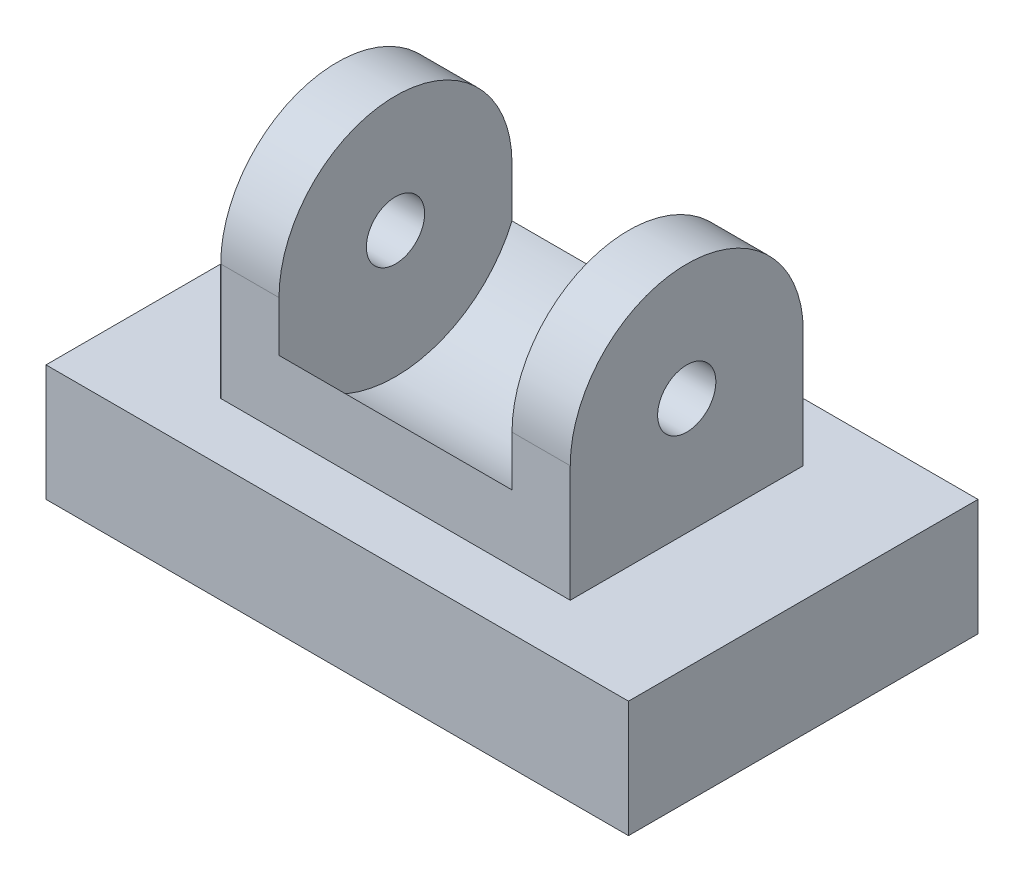
ISO-10303-21;
HEADER;
FILE_DESCRIPTION(('STEP AP214'),'2;1');
FILE_NAME('part.step','',(''),(''),'','','');
FILE_SCHEMA(('AUTOMOTIVE_DESIGN { 1 0 10303 214 1 1 1 1 }'));
ENDSEC;
DATA;
#1=APPLICATION_CONTEXT('core data for automotive mechanical design processes');
#2=APPLICATION_PROTOCOL_DEFINITION('international standard','automotive_design',2000,#1);
#3=PRODUCT_CONTEXT('',#1,'mechanical');
#4=PRODUCT('Part','Part','',(#3));
#5=PRODUCT_RELATED_PRODUCT_CATEGORY('part','',(#4));
#6=PRODUCT_DEFINITION_FORMATION('','',#4);
#7=PRODUCT_DEFINITION_CONTEXT('part definition',#1,'design');
#8=PRODUCT_DEFINITION('design','',#6,#7);
#9=PRODUCT_DEFINITION_SHAPE('','',#8);
#10=(LENGTH_UNIT() NAMED_UNIT(*) SI_UNIT(.MILLI.,.METRE.));
#11=(NAMED_UNIT(*) PLANE_ANGLE_UNIT() SI_UNIT($,.RADIAN.));
#12=(NAMED_UNIT(*) SI_UNIT($,.STERADIAN.) SOLID_ANGLE_UNIT());
#13=UNCERTAINTY_MEASURE_WITH_UNIT(LENGTH_MEASURE(1.E-05),#10,'distance_accuracy_value','');
#14=(GEOMETRIC_REPRESENTATION_CONTEXT(3) GLOBAL_UNCERTAINTY_ASSIGNED_CONTEXT((#13)) GLOBAL_UNIT_ASSIGNED_CONTEXT((#10,
#11,#12)) REPRESENTATION_CONTEXT('',''));
#15=CARTESIAN_POINT('',(0.,0.,0.));
#16=DIRECTION('',(0.,0.,1.));
#17=DIRECTION('',(1.,0.,0.));
#18=AXIS2_PLACEMENT_3D('',#15,#16,#17);
#19=CARTESIAN_POINT('',(-15.,20.,0.));
#20=DIRECTION('',(1.,0.,0.));
#21=DIRECTION('',(0.,0.,-1.));
#22=AXIS2_PLACEMENT_3D('',#19,#20,#21);
#23=CYLINDRICAL_SURFACE('',#22,10.);
#24=DIRECTION('',(1.,0.,0.));
#25=VECTOR('',#24,1.);
#26=CARTESIAN_POINT('',(-15.,20.,10.));
#27=LINE('',#26,#25);
#28=CARTESIAN_POINT('',(-15.,20.,10.));
#29=VERTEX_POINT('',#28);
#30=CARTESIAN_POINT('',(-10.,20.,10.));
#31=VERTEX_POINT('',#30);
#32=EDGE_CURVE('E192',#29,#31,#27,.T.);
#33=ORIENTED_EDGE('',*,*,#32,.T.);
#34=CARTESIAN_POINT('',(-10.,20.,0.));
#35=DIRECTION('',(1.,0.,0.));
#36=DIRECTION('',(0.,0.,-1.));
#37=AXIS2_PLACEMENT_3D('',#34,#35,#36);
#38=CIRCLE('',#37,10.);
#39=CARTESIAN_POINT('',(-10.,20.,-10.));
#40=VERTEX_POINT('',#39);
#41=EDGE_CURVE('E48',#31,#40,#38,.F.);
#42=ORIENTED_EDGE('',*,*,#41,.T.);
#43=DIRECTION('',(1.,0.,0.));
#44=VECTOR('',#43,1.);
#45=CARTESIAN_POINT('',(-15.,20.,-10.));
#46=LINE('',#45,#44);
#47=CARTESIAN_POINT('',(-15.,20.,-10.));
#48=VERTEX_POINT('',#47);
#49=EDGE_CURVE('E182',#48,#40,#46,.T.);
#50=ORIENTED_EDGE('',*,*,#49,.F.);
#51=CARTESIAN_POINT('',(-15.,20.,0.));
#52=DIRECTION('',(1.,0.,0.));
#53=DIRECTION('',(0.,0.,-1.));
#54=AXIS2_PLACEMENT_3D('',#51,#52,#53);
#55=CIRCLE('',#54,10.);
#56=EDGE_CURVE('E170',#48,#29,#55,.T.);
#57=ORIENTED_EDGE('',*,*,#56,.T.);
#58=EDGE_LOOP('',(#33,#42,#50,#57));
#59=FACE_BOUND('',#58,.T.);
#60=ADVANCED_FACE('F33',(#59),#23,.T.);
#61=CARTESIAN_POINT('',(-15.,20.,0.));
#62=DIRECTION('',(1.,0.,0.));
#63=DIRECTION('',(0.,0.,-1.));
#64=AXIS2_PLACEMENT_3D('',#61,#62,#63);
#65=CYLINDRICAL_SURFACE('',#64,2.5);
#66=CARTESIAN_POINT('',(-15.,20.,0.));
#67=DIRECTION('',(1.,0.,0.));
#68=DIRECTION('',(0.,0.,-1.));
#69=AXIS2_PLACEMENT_3D('',#66,#67,#68);
#70=CIRCLE('',#69,2.5);
#71=CARTESIAN_POINT('',(-15.,20.,-2.5));
#72=VERTEX_POINT('',#71);
#73=EDGE_CURVE('E167',#72,#72,#70,.T.);
#74=ORIENTED_EDGE('',*,*,#73,.F.);
#75=EDGE_LOOP('',(#74));
#76=FACE_BOUND('',#75,.T.);
#77=CARTESIAN_POINT('',(-10.,20.,0.));
#78=DIRECTION('',(1.,0.,0.));
#79=DIRECTION('',(0.,0.,-1.));
#80=AXIS2_PLACEMENT_3D('',#77,#78,#79);
#81=CIRCLE('',#80,2.5);
#82=CARTESIAN_POINT('',(-10.,20.,-2.5));
#83=VERTEX_POINT('',#82);
#84=EDGE_CURVE('E137',#83,#83,#81,.T.);
#85=ORIENTED_EDGE('',*,*,#84,.T.);
#86=EDGE_LOOP('',(#85));
#87=FACE_BOUND('',#86,.T.);
#88=ADVANCED_FACE('F243',(#76,#87),#65,.F.);
#89=CARTESIAN_POINT('',(0.,10.,0.));
#90=DIRECTION('',(0.,-1.,0.));
#91=DIRECTION('',(0.,0.,-1.));
#92=AXIS2_PLACEMENT_3D('',#89,#90,#91);
#93=PLANE('',#92);
#94=DIRECTION('',(0.,0.,1.));
#95=VECTOR('',#94,1.);
#96=CARTESIAN_POINT('',(-25.,10.,-15.));
#97=LINE('',#96,#95);
#98=CARTESIAN_POINT('',(-25.,10.,-15.));
#99=VERTEX_POINT('',#98);
#100=CARTESIAN_POINT('',(-25.,10.,15.));
#101=VERTEX_POINT('',#100);
#102=EDGE_CURVE('E194',#99,#101,#97,.T.);
#103=ORIENTED_EDGE('',*,*,#102,.T.);
#104=DIRECTION('',(1.,0.,0.));
#105=VECTOR('',#104,1.);
#106=CARTESIAN_POINT('',(25.,10.,15.));
#107=LINE('',#106,#105);
#108=CARTESIAN_POINT('',(25.,10.,15.));
#109=VERTEX_POINT('',#108);
#110=EDGE_CURVE('E197',#101,#109,#107,.T.);
#111=ORIENTED_EDGE('',*,*,#110,.T.);
#112=DIRECTION('',(0.,0.,-1.));
#113=VECTOR('',#112,1.);
#114=CARTESIAN_POINT('',(25.,10.,-15.));
#115=LINE('',#114,#113);
#116=CARTESIAN_POINT('',(25.,10.,-15.));
#117=VERTEX_POINT('',#116);
#118=EDGE_CURVE('E200',#109,#117,#115,.T.);
#119=ORIENTED_EDGE('',*,*,#118,.T.);
#120=DIRECTION('',(-1.,0.,0.));
#121=VECTOR('',#120,1.);
#122=CARTESIAN_POINT('',(25.,10.,-15.));
#123=LINE('',#122,#121);
#124=EDGE_CURVE('E202',#117,#99,#123,.T.);
#125=ORIENTED_EDGE('',*,*,#124,.T.);
#126=EDGE_LOOP('',(#103,#111,#119,#125));
#127=FACE_BOUND('',#126,.T.);
#128=DIRECTION('',(0.,0.,-1.));
#129=VECTOR('',#128,1.);
#130=CARTESIAN_POINT('',(-15.,10.,-10.));
#131=LINE('',#130,#129);
#132=CARTESIAN_POINT('',(-15.,10.,10.));
#133=VERTEX_POINT('',#132);
#134=CARTESIAN_POINT('',(-15.,10.,-10.));
#135=VERTEX_POINT('',#134);
#136=EDGE_CURVE('E176',#133,#135,#131,.T.);
#137=ORIENTED_EDGE('',*,*,#136,.T.);
#138=DIRECTION('',(1.,0.,0.));
#139=VECTOR('',#138,1.);
#140=CARTESIAN_POINT('',(-15.,10.,-10.));
#141=LINE('',#140,#139);
#142=CARTESIAN_POINT('',(15.,10.,-10.));
#143=VERTEX_POINT('',#142);
#144=EDGE_CURVE('E187',#135,#143,#141,.T.);
#145=ORIENTED_EDGE('',*,*,#144,.T.);
#146=DIRECTION('',(0.,0.,-1.));
#147=VECTOR('',#146,1.);
#148=CARTESIAN_POINT('',(15.,10.,-10.));
#149=LINE('',#148,#147);
#150=CARTESIAN_POINT('',(15.,10.,10.));
#151=VERTEX_POINT('',#150);
#152=EDGE_CURVE('E162',#151,#143,#149,.T.);
#153=ORIENTED_EDGE('',*,*,#152,.F.);
#154=DIRECTION('',(1.,0.,0.));
#155=VECTOR('',#154,1.);
#156=CARTESIAN_POINT('',(-15.,10.,10.));
#157=LINE('',#156,#155);
#158=EDGE_CURVE('E190',#133,#151,#157,.T.);
#159=ORIENTED_EDGE('',*,*,#158,.F.);
#160=EDGE_LOOP('',(#137,#145,#153,#159));
#161=FACE_BOUND('',#160,.T.);
#162=ADVANCED_FACE('F240',(#127,#161),#93,.F.);
#163=CARTESIAN_POINT('',(-25.,10.,-15.));
#164=DIRECTION('',(1.,0.,0.));
#165=DIRECTION('',(0.,0.,-1.));
#166=AXIS2_PLACEMENT_3D('',#163,#164,#165);
#167=PLANE('',#166);
#168=DIRECTION('',(0.,0.,1.));
#169=VECTOR('',#168,1.);
#170=CARTESIAN_POINT('',(-25.,0.,-15.));
#171=LINE('',#170,#169);
#172=CARTESIAN_POINT('',(-25.,0.,-15.));
#173=VERTEX_POINT('',#172);
#174=CARTESIAN_POINT('',(-25.,0.,15.));
#175=VERTEX_POINT('',#174);
#176=EDGE_CURVE('E185',#173,#175,#171,.T.);
#177=ORIENTED_EDGE('',*,*,#176,.T.);
#178=DIRECTION('',(0.,-1.,0.));
#179=VECTOR('',#178,1.);
#180=CARTESIAN_POINT('',(-25.,10.,15.));
#181=LINE('',#180,#179);
#182=EDGE_CURVE('E41',#101,#175,#181,.T.);
#183=ORIENTED_EDGE('',*,*,#182,.F.);
#184=ORIENTED_EDGE('',*,*,#102,.F.);
#185=DIRECTION('',(0.,-1.,0.));
#186=VECTOR('',#185,1.);
#187=CARTESIAN_POINT('',(-25.,10.,-15.));
#188=LINE('',#187,#186);
#189=EDGE_CURVE('E204',#99,#173,#188,.T.);
#190=ORIENTED_EDGE('',*,*,#189,.T.);
#191=EDGE_LOOP('',(#177,#183,#184,#190));
#192=FACE_BOUND('',#191,.T.);
#193=ADVANCED_FACE('F35',(#192),#167,.F.);
#194=CARTESIAN_POINT('',(25.,10.,15.));
#195=DIRECTION('',(0.,0.,-1.));
#196=DIRECTION('',(-1.,0.,0.));
#197=AXIS2_PLACEMENT_3D('',#194,#195,#196);
#198=PLANE('',#197);
#199=DIRECTION('',(1.,0.,0.));
#200=VECTOR('',#199,1.);
#201=CARTESIAN_POINT('',(25.,0.,15.));
#202=LINE('',#201,#200);
#203=CARTESIAN_POINT('',(25.,0.,15.));
#204=VERTEX_POINT('',#203);
#205=EDGE_CURVE('E207',#175,#204,#202,.T.);
#206=ORIENTED_EDGE('',*,*,#205,.T.);
#207=DIRECTION('',(0.,-1.,0.));
#208=VECTOR('',#207,1.);
#209=CARTESIAN_POINT('',(25.,10.,15.));
#210=LINE('',#209,#208);
#211=EDGE_CURVE('E217',#109,#204,#210,.T.);
#212=ORIENTED_EDGE('',*,*,#211,.F.);
#213=ORIENTED_EDGE('',*,*,#110,.F.);
#214=ORIENTED_EDGE('',*,*,#182,.T.);
#215=EDGE_LOOP('',(#206,#212,#213,#214));
#216=FACE_BOUND('',#215,.T.);
#217=ADVANCED_FACE('F222',(#216),#198,.F.);
#218=CARTESIAN_POINT('',(25.,10.,-15.));
#219=DIRECTION('',(-1.,0.,0.));
#220=DIRECTION('',(0.,0.,1.));
#221=AXIS2_PLACEMENT_3D('',#218,#219,#220);
#222=PLANE('',#221);
#223=DIRECTION('',(0.,0.,-1.));
#224=VECTOR('',#223,1.);
#225=CARTESIAN_POINT('',(25.,0.,-15.));
#226=LINE('',#225,#224);
#227=CARTESIAN_POINT('',(25.,0.,-15.));
#228=VERTEX_POINT('',#227);
#229=EDGE_CURVE('E209',#204,#228,#226,.T.);
#230=ORIENTED_EDGE('',*,*,#229,.T.);
#231=DIRECTION('',(0.,-1.,0.));
#232=VECTOR('',#231,1.);
#233=CARTESIAN_POINT('',(25.,10.,-15.));
#234=LINE('',#233,#232);
#235=EDGE_CURVE('E214',#117,#228,#234,.T.);
#236=ORIENTED_EDGE('',*,*,#235,.F.);
#237=ORIENTED_EDGE('',*,*,#118,.F.);
#238=ORIENTED_EDGE('',*,*,#211,.T.);
#239=EDGE_LOOP('',(#230,#236,#237,#238));
#240=FACE_BOUND('',#239,.T.);
#241=ADVANCED_FACE('F234',(#240),#222,.F.);
#242=CARTESIAN_POINT('',(25.,10.,-15.));
#243=DIRECTION('',(0.,0.,1.));
#244=DIRECTION('',(1.,0.,0.));
#245=AXIS2_PLACEMENT_3D('',#242,#243,#244);
#246=PLANE('',#245);
#247=DIRECTION('',(-1.,0.,0.));
#248=VECTOR('',#247,1.);
#249=CARTESIAN_POINT('',(25.,0.,-15.));
#250=LINE('',#249,#248);
#251=EDGE_CURVE('E198',#228,#173,#250,.T.);
#252=ORIENTED_EDGE('',*,*,#251,.T.);
#253=ORIENTED_EDGE('',*,*,#189,.F.);
#254=ORIENTED_EDGE('',*,*,#124,.F.);
#255=ORIENTED_EDGE('',*,*,#235,.T.);
#256=EDGE_LOOP('',(#252,#253,#254,#255));
#257=FACE_BOUND('',#256,.T.);
#258=ADVANCED_FACE('F238',(#257),#246,.F.);
#259=CARTESIAN_POINT('',(0.,0.,0.));
#260=DIRECTION('',(0.,-1.,0.));
#261=DIRECTION('',(0.,0.,-1.));
#262=AXIS2_PLACEMENT_3D('',#259,#260,#261);
#263=PLANE('',#262);
#264=ORIENTED_EDGE('',*,*,#176,.F.);
#265=ORIENTED_EDGE('',*,*,#251,.F.);
#266=ORIENTED_EDGE('',*,*,#229,.F.);
#267=ORIENTED_EDGE('',*,*,#205,.F.);
#268=EDGE_LOOP('',(#264,#265,#266,#267));
#269=FACE_BOUND('',#268,.T.);
#270=ADVANCED_FACE('F230',(#269),#263,.T.);
#271=CARTESIAN_POINT('',(10.,20.,0.));
#272=DIRECTION('',(1.,0.,0.));
#273=DIRECTION('',(0.,0.,-1.));
#274=AXIS2_PLACEMENT_3D('',#271,#272,#273);
#275=CIRCLE('',#274,10.);
#276=CARTESIAN_POINT('',(10.,20.,10.));
#277=VERTEX_POINT('',#276);
#278=CARTESIAN_POINT('',(10.,20.,-10.));
#279=VERTEX_POINT('',#278);
#280=EDGE_CURVE('E146',#277,#279,#275,.F.);
#281=ORIENTED_EDGE('',*,*,#280,.F.);
#282=CARTESIAN_POINT('',(15.,20.,10.));
#283=VERTEX_POINT('',#282);
#284=EDGE_CURVE('E143',#277,#283,#27,.T.);
#285=ORIENTED_EDGE('',*,*,#284,.T.);
#286=CARTESIAN_POINT('',(15.,20.,0.));
#287=DIRECTION('',(1.,0.,0.));
#288=DIRECTION('',(0.,0.,-1.));
#289=AXIS2_PLACEMENT_3D('',#286,#287,#288);
#290=CIRCLE('',#289,10.);
#291=CARTESIAN_POINT('',(15.,20.,-10.));
#292=VERTEX_POINT('',#291);
#293=EDGE_CURVE('E159',#292,#283,#290,.T.);
#294=ORIENTED_EDGE('',*,*,#293,.F.);
#295=EDGE_CURVE('E186',#279,#292,#46,.T.);
#296=ORIENTED_EDGE('',*,*,#295,.F.);
#297=EDGE_LOOP('',(#281,#285,#294,#296));
#298=FACE_BOUND('',#297,.T.);
#299=ADVANCED_FACE('F262',(#298),#23,.T.);
#300=CARTESIAN_POINT('',(-15.,20.,-10.));
#301=DIRECTION('',(0.,0.,-1.));
#302=DIRECTION('',(-1.,0.,0.));
#303=AXIS2_PLACEMENT_3D('',#300,#301,#302);
#304=PLANE('',#303);
#305=DIRECTION('',(0.,-1.,0.));
#306=VECTOR('',#305,1.);
#307=CARTESIAN_POINT('',(10.,20.,-10.));
#308=LINE('',#307,#306);
#309=CARTESIAN_POINT('',(10.,15.7030994434844,-10.));
#310=VERTEX_POINT('',#309);
#311=EDGE_CURVE('E149',#279,#310,#308,.T.);
#312=ORIENTED_EDGE('',*,*,#311,.F.);
#313=ORIENTED_EDGE('',*,*,#295,.T.);
#314=DIRECTION('',(0.,1.,0.));
#315=VECTOR('',#314,1.);
#316=CARTESIAN_POINT('',(15.,20.,-10.));
#317=LINE('',#316,#315);
#318=EDGE_CURVE('E164',#143,#292,#317,.T.);
#319=ORIENTED_EDGE('',*,*,#318,.F.);
#320=ORIENTED_EDGE('',*,*,#144,.F.);
#321=DIRECTION('',(0.,1.,0.));
#322=VECTOR('',#321,1.);
#323=CARTESIAN_POINT('',(-15.,20.,-10.));
#324=LINE('',#323,#322);
#325=EDGE_CURVE('E179',#135,#48,#324,.T.);
#326=ORIENTED_EDGE('',*,*,#325,.T.);
#327=ORIENTED_EDGE('',*,*,#49,.T.);
#328=DIRECTION('',(0.,-1.,0.));
#329=VECTOR('',#328,1.);
#330=CARTESIAN_POINT('',(-10.,20.,-10.));
#331=LINE('',#330,#329);
#332=CARTESIAN_POINT('',(-10.,15.7030994434844,-10.));
#333=VERTEX_POINT('',#332);
#334=EDGE_CURVE('E147',#40,#333,#331,.T.);
#335=ORIENTED_EDGE('',*,*,#334,.T.);
#336=DIRECTION('',(-1.,0.,0.));
#337=VECTOR('',#336,1.);
#338=CARTESIAN_POINT('',(10.,15.7030994434844,-10.));
#339=LINE('',#338,#337);
#340=EDGE_CURVE('E135',#333,#310,#339,.F.);
#341=ORIENTED_EDGE('',*,*,#340,.T.);
#342=EDGE_LOOP('',(#312,#313,#319,#320,#326,#327,#335,#341));
#343=FACE_BOUND('',#342,.T.);
#344=ADVANCED_FACE('F255',(#343),#304,.T.);
#345=CARTESIAN_POINT('',(-15.,20.,10.));
#346=DIRECTION('',(0.,0.,1.));
#347=DIRECTION('',(1.,0.,0.));
#348=AXIS2_PLACEMENT_3D('',#345,#346,#347);
#349=PLANE('',#348);
#350=DIRECTION('',(0.,1.,0.));
#351=VECTOR('',#350,1.);
#352=CARTESIAN_POINT('',(10.,20.,10.));
#353=LINE('',#352,#351);
#354=CARTESIAN_POINT('',(10.,15.7030994434844,10.));
#355=VERTEX_POINT('',#354);
#356=EDGE_CURVE('E142',#355,#277,#353,.T.);
#357=ORIENTED_EDGE('',*,*,#356,.F.);
#358=DIRECTION('',(-1.,0.,0.));
#359=VECTOR('',#358,1.);
#360=CARTESIAN_POINT('',(10.,15.7030994434844,10.));
#361=LINE('',#360,#359);
#362=CARTESIAN_POINT('',(-10.,15.7030994434844,10.));
#363=VERTEX_POINT('',#362);
#364=EDGE_CURVE('E11',#355,#363,#361,.T.);
#365=ORIENTED_EDGE('',*,*,#364,.T.);
#366=DIRECTION('',(0.,1.,0.));
#367=VECTOR('',#366,1.);
#368=CARTESIAN_POINT('',(-10.,20.,10.));
#369=LINE('',#368,#367);
#370=EDGE_CURVE('E121',#363,#31,#369,.T.);
#371=ORIENTED_EDGE('',*,*,#370,.T.);
#372=ORIENTED_EDGE('',*,*,#32,.F.);
#373=DIRECTION('',(0.,-1.,0.));
#374=VECTOR('',#373,1.);
#375=CARTESIAN_POINT('',(-15.,20.,10.));
#376=LINE('',#375,#374);
#377=EDGE_CURVE('E173',#29,#133,#376,.T.);
#378=ORIENTED_EDGE('',*,*,#377,.T.);
#379=ORIENTED_EDGE('',*,*,#158,.T.);
#380=DIRECTION('',(0.,-1.,0.));
#381=VECTOR('',#380,1.);
#382=CARTESIAN_POINT('',(15.,20.,10.));
#383=LINE('',#382,#381);
#384=EDGE_CURVE('E56',#283,#151,#383,.T.);
#385=ORIENTED_EDGE('',*,*,#384,.F.);
#386=ORIENTED_EDGE('',*,*,#284,.F.);
#387=EDGE_LOOP('',(#357,#365,#371,#372,#378,#379,#385,#386));
#388=FACE_BOUND('',#387,.T.);
#389=ADVANCED_FACE('F140',(#388),#349,.T.);
#390=CARTESIAN_POINT('',(-15.,20.,0.));
#391=DIRECTION('',(1.,0.,0.));
#392=DIRECTION('',(0.,0.,-1.));
#393=AXIS2_PLACEMENT_3D('',#390,#391,#392);
#394=PLANE('',#393);
#395=ORIENTED_EDGE('',*,*,#73,.T.);
#396=EDGE_LOOP('',(#395));
#397=FACE_BOUND('',#396,.T.);
#398=ORIENTED_EDGE('',*,*,#56,.F.);
#399=ORIENTED_EDGE('',*,*,#325,.F.);
#400=ORIENTED_EDGE('',*,*,#136,.F.);
#401=ORIENTED_EDGE('',*,*,#377,.F.);
#402=EDGE_LOOP('',(#398,#399,#400,#401));
#403=FACE_BOUND('',#402,.T.);
#404=ADVANCED_FACE('F251',(#397,#403),#394,.F.);
#405=CARTESIAN_POINT('',(10.,20.,0.));
#406=DIRECTION('',(1.,0.,0.));
#407=DIRECTION('',(0.,0.,-1.));
#408=AXIS2_PLACEMENT_3D('',#405,#406,#407);
#409=CIRCLE('',#408,2.5);
#410=CARTESIAN_POINT('',(10.,20.,-2.5));
#411=VERTEX_POINT('',#410);
#412=EDGE_CURVE('E136',#411,#411,#409,.T.);
#413=ORIENTED_EDGE('',*,*,#412,.F.);
#414=EDGE_LOOP('',(#413));
#415=FACE_BOUND('',#414,.T.);
#416=CARTESIAN_POINT('',(15.,20.,0.));
#417=DIRECTION('',(1.,0.,0.));
#418=DIRECTION('',(0.,0.,-1.));
#419=AXIS2_PLACEMENT_3D('',#416,#417,#418);
#420=CIRCLE('',#419,2.5);
#421=CARTESIAN_POINT('',(15.,20.,-2.5));
#422=VERTEX_POINT('',#421);
#423=EDGE_CURVE('E156',#422,#422,#420,.T.);
#424=ORIENTED_EDGE('',*,*,#423,.T.);
#425=EDGE_LOOP('',(#424));
#426=FACE_BOUND('',#425,.T.);
#427=ADVANCED_FACE('F287',(#415,#426),#65,.F.);
#428=CARTESIAN_POINT('',(15.,20.,0.));
#429=DIRECTION('',(1.,0.,0.));
#430=DIRECTION('',(0.,0.,-1.));
#431=AXIS2_PLACEMENT_3D('',#428,#429,#430);
#432=PLANE('',#431);
#433=ORIENTED_EDGE('',*,*,#293,.T.);
#434=ORIENTED_EDGE('',*,*,#384,.T.);
#435=ORIENTED_EDGE('',*,*,#152,.T.);
#436=ORIENTED_EDGE('',*,*,#318,.T.);
#437=EDGE_LOOP('',(#433,#434,#435,#436));
#438=FACE_BOUND('',#437,.T.);
#439=ORIENTED_EDGE('',*,*,#423,.F.);
#440=EDGE_LOOP('',(#439));
#441=FACE_BOUND('',#440,.T.);
#442=ADVANCED_FACE('F259',(#438,#441),#432,.T.);
#443=CARTESIAN_POINT('',(10.,20.,0.));
#444=DIRECTION('',(1.,0.,0.));
#445=DIRECTION('',(0.,0.,-1.));
#446=AXIS2_PLACEMENT_3D('',#443,#444,#445);
#447=PLANE('',#446);
#448=ORIENTED_EDGE('',*,*,#311,.T.);
#449=CARTESIAN_POINT('',(10.,20.,0.));
#450=DIRECTION('',(1.,0.,0.));
#451=DIRECTION('',(0.,0.,-1.));
#452=AXIS2_PLACEMENT_3D('',#449,#450,#451);
#453=CIRCLE('',#452,10.8840872098943);
#454=EDGE_CURVE('E128',#355,#310,#453,.T.);
#455=ORIENTED_EDGE('',*,*,#454,.F.);
#456=ORIENTED_EDGE('',*,*,#356,.T.);
#457=ORIENTED_EDGE('',*,*,#280,.T.);
#458=EDGE_LOOP('',(#448,#455,#456,#457));
#459=FACE_BOUND('',#458,.T.);
#460=ORIENTED_EDGE('',*,*,#412,.T.);
#461=EDGE_LOOP('',(#460));
#462=FACE_BOUND('',#461,.T.);
#463=ADVANCED_FACE('F263',(#459,#462),#447,.F.);
#464=CARTESIAN_POINT('',(10.,20.,0.));
#465=DIRECTION('',(-1.,0.,0.));
#466=DIRECTION('',(0.,0.,1.));
#467=AXIS2_PLACEMENT_3D('',#464,#465,#466);
#468=CYLINDRICAL_SURFACE('',#467,10.8840872098943);
#469=CARTESIAN_POINT('',(-10.,20.,0.));
#470=DIRECTION('',(1.,0.,0.));
#471=DIRECTION('',(0.,0.,-1.));
#472=AXIS2_PLACEMENT_3D('',#469,#470,#471);
#473=CIRCLE('',#472,10.8840872098943);
#474=EDGE_CURVE('E124',#363,#333,#473,.T.);
#475=ORIENTED_EDGE('',*,*,#474,.F.);
#476=ORIENTED_EDGE('',*,*,#364,.F.);
#477=ORIENTED_EDGE('',*,*,#454,.T.);
#478=ORIENTED_EDGE('',*,*,#340,.F.);
#479=EDGE_LOOP('',(#475,#476,#477,#478));
#480=FACE_BOUND('',#479,.T.);
#481=ADVANCED_FACE('F131',(#480),#468,.F.);
#482=CARTESIAN_POINT('',(-10.,20.,0.));
#483=DIRECTION('',(1.,0.,0.));
#484=DIRECTION('',(0.,0.,-1.));
#485=AXIS2_PLACEMENT_3D('',#482,#483,#484);
#486=PLANE('',#485);
#487=ORIENTED_EDGE('',*,*,#84,.F.);
#488=EDGE_LOOP('',(#487));
#489=FACE_BOUND('',#488,.T.);
#490=ORIENTED_EDGE('',*,*,#41,.F.);
#491=ORIENTED_EDGE('',*,*,#370,.F.);
#492=ORIENTED_EDGE('',*,*,#474,.T.);
#493=ORIENTED_EDGE('',*,*,#334,.F.);
#494=EDGE_LOOP('',(#490,#491,#492,#493));
#495=FACE_BOUND('',#494,.T.);
#496=ADVANCED_FACE('F123',(#489,#495),#486,.T.);
#497=CLOSED_SHELL('',(#60,#88,#162,#193,#217,#241,#258,#270,#299,#344,#389,#404,#427,#442,#463,
#481,#496));
#498=MANIFOLD_SOLID_BREP('B2',#497);
#499=ADVANCED_BREP_SHAPE_REPRESENTATION('',(#18,#498),#14);
#500=SHAPE_DEFINITION_REPRESENTATION(#9,#499);
ENDSEC;
END-ISO-10303-21;
